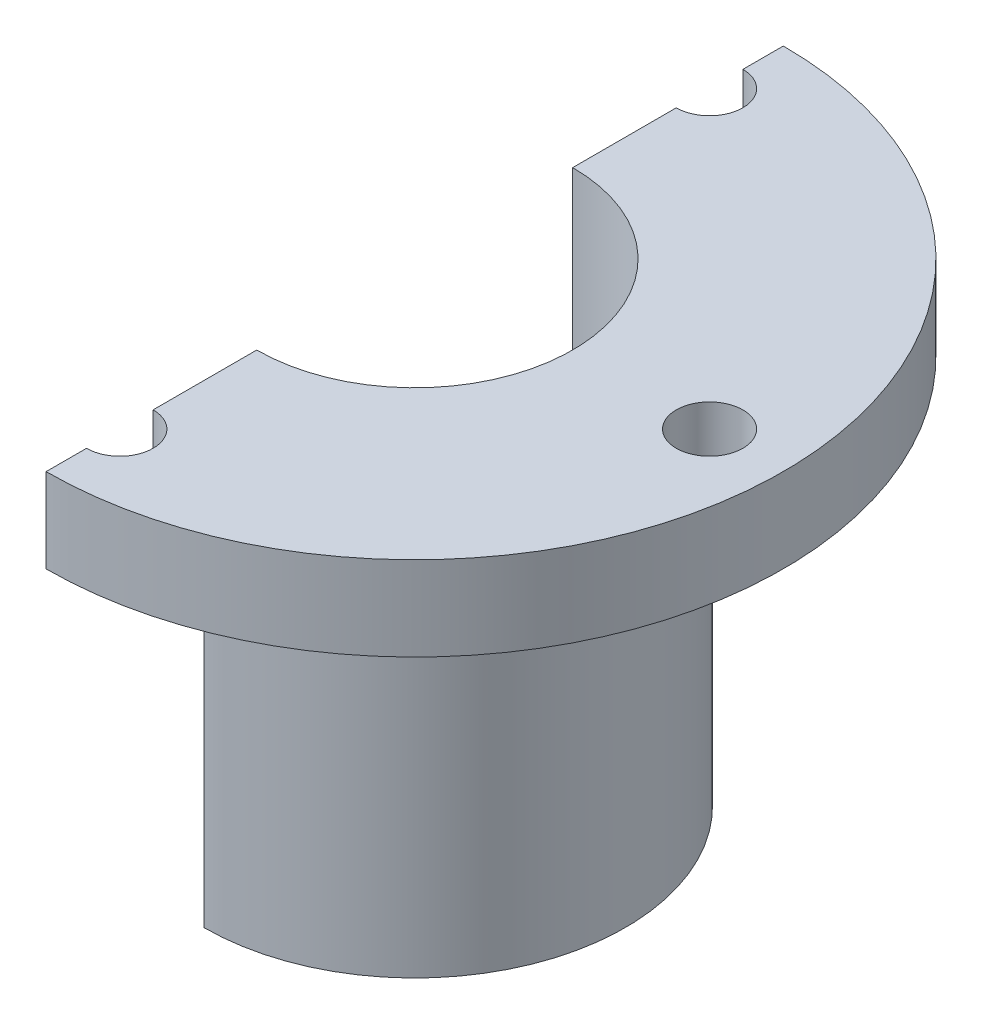
ISO-10303-21;
HEADER;
FILE_DESCRIPTION(('STEP AP214'),'2;1');
FILE_NAME('part.step','',(''),(''),'','','');
FILE_SCHEMA(('AUTOMOTIVE_DESIGN { 1 0 10303 214 1 1 1 1 }'));
ENDSEC;
DATA;
#1=APPLICATION_CONTEXT('core data for automotive mechanical design processes');
#2=APPLICATION_PROTOCOL_DEFINITION('international standard','automotive_design',2000,#1);
#3=PRODUCT_CONTEXT('',#1,'mechanical');
#4=PRODUCT('Part','Part','',(#3));
#5=PRODUCT_RELATED_PRODUCT_CATEGORY('part','',(#4));
#6=PRODUCT_DEFINITION_FORMATION('','',#4);
#7=PRODUCT_DEFINITION_CONTEXT('part definition',#1,'design');
#8=PRODUCT_DEFINITION('design','',#6,#7);
#9=PRODUCT_DEFINITION_SHAPE('','',#8);
#10=(LENGTH_UNIT() NAMED_UNIT(*) SI_UNIT(.MILLI.,.METRE.));
#11=(NAMED_UNIT(*) PLANE_ANGLE_UNIT() SI_UNIT($,.RADIAN.));
#12=(NAMED_UNIT(*) SI_UNIT($,.STERADIAN.) SOLID_ANGLE_UNIT());
#13=UNCERTAINTY_MEASURE_WITH_UNIT(LENGTH_MEASURE(1.E-05),#10,'distance_accuracy_value','');
#14=(GEOMETRIC_REPRESENTATION_CONTEXT(3) GLOBAL_UNCERTAINTY_ASSIGNED_CONTEXT((#13)) GLOBAL_UNIT_ASSIGNED_CONTEXT((#10,
#11,#12)) REPRESENTATION_CONTEXT('',''));
#15=CARTESIAN_POINT('',(0.,0.,0.));
#16=DIRECTION('',(0.,0.,1.));
#17=DIRECTION('',(1.,0.,0.));
#18=AXIS2_PLACEMENT_3D('',#15,#16,#17);
#19=CARTESIAN_POINT('',(0.,0.,15.0000000000001));
#20=DIRECTION('',(1.,0.,0.));
#21=DIRECTION('',(0.,0.,-1.));
#22=AXIS2_PLACEMENT_3D('',#19,#20,#21);
#23=PLANE('',#22);
#24=DIRECTION('',(0.,0.,-1.));
#25=VECTOR('',#24,1.);
#26=CARTESIAN_POINT('',(0.,17.,20.));
#27=LINE('',#26,#25);
#28=CARTESIAN_POINT('',(0.,17.,24.8377223398316));
#29=VERTEX_POINT('',#28);
#30=CARTESIAN_POINT('',(0.,17.,20.));
#31=VERTEX_POINT('',#30);
#32=EDGE_CURVE('E163',#29,#31,#27,.T.);
#33=ORIENTED_EDGE('',*,*,#32,.F.);
#34=DIRECTION('',(0.,1.,0.));
#35=VECTOR('',#34,1.);
#36=CARTESIAN_POINT('',(0.,-20.,24.8377223398316));
#37=LINE('',#36,#35);
#38=CARTESIAN_POINT('',(0.,25.,24.8377223398316));
#39=VERTEX_POINT('',#38);
#40=EDGE_CURVE('E11',#29,#39,#37,.T.);
#41=ORIENTED_EDGE('',*,*,#40,.T.);
#42=DIRECTION('',(0.,0.,1.));
#43=VECTOR('',#42,1.);
#44=CARTESIAN_POINT('',(0.,25.,35.));
#45=LINE('',#44,#43);
#46=CARTESIAN_POINT('',(0.,25.,15.0000000000001));
#47=VERTEX_POINT('',#46);
#48=EDGE_CURVE('E148',#47,#39,#45,.T.);
#49=ORIENTED_EDGE('',*,*,#48,.F.);
#50=DIRECTION('',(0.,1.,0.));
#51=VECTOR('',#50,1.);
#52=CARTESIAN_POINT('',(0.,25.,15.0000000000001));
#53=LINE('',#52,#51);
#54=CARTESIAN_POINT('',(0.,6.,15.0000000000001));
#55=VERTEX_POINT('',#54);
#56=EDGE_CURVE('E157',#55,#47,#53,.T.);
#57=ORIENTED_EDGE('',*,*,#56,.F.);
#58=DIRECTION('',(0.,0.,1.));
#59=VECTOR('',#58,1.);
#60=CARTESIAN_POINT('',(0.,6.,7.));
#61=LINE('',#60,#59);
#62=CARTESIAN_POINT('',(0.,6.,7.));
#63=VERTEX_POINT('',#62);
#64=EDGE_CURVE('E159',#63,#55,#61,.T.);
#65=ORIENTED_EDGE('',*,*,#64,.F.);
#66=DIRECTION('',(0.,1.,0.));
#67=VECTOR('',#66,1.);
#68=CARTESIAN_POINT('',(0.,0.,7.));
#69=LINE('',#68,#67);
#70=CARTESIAN_POINT('',(0.,0.,7.));
#71=VERTEX_POINT('',#70);
#72=EDGE_CURVE('E263',#71,#63,#69,.T.);
#73=ORIENTED_EDGE('',*,*,#72,.F.);
#74=DIRECTION('',(0.,0.,-1.));
#75=VECTOR('',#74,1.);
#76=CARTESIAN_POINT('',(0.,0.,7.));
#77=LINE('',#76,#75);
#78=CARTESIAN_POINT('',(0.,0.,17.5));
#79=VERTEX_POINT('',#78);
#80=EDGE_CURVE('E256',#79,#71,#77,.T.);
#81=ORIENTED_EDGE('',*,*,#80,.F.);
#82=DIRECTION('',(0.,1.,0.));
#83=VECTOR('',#82,1.);
#84=CARTESIAN_POINT('',(0.,0.,17.5));
#85=LINE('',#84,#83);
#86=CARTESIAN_POINT('',(0.,-20.,17.5));
#87=VERTEX_POINT('',#86);
#88=EDGE_CURVE('E171',#87,#79,#85,.T.);
#89=ORIENTED_EDGE('',*,*,#88,.F.);
#90=DIRECTION('',(0.,0.,-1.));
#91=VECTOR('',#90,1.);
#92=CARTESIAN_POINT('',(0.,-20.,17.5));
#93=LINE('',#92,#91);
#94=CARTESIAN_POINT('',(0.,-20.,20.));
#95=VERTEX_POINT('',#94);
#96=EDGE_CURVE('E169',#95,#87,#93,.T.);
#97=ORIENTED_EDGE('',*,*,#96,.F.);
#98=DIRECTION('',(0.,-1.,0.));
#99=VECTOR('',#98,1.);
#100=CARTESIAN_POINT('',(0.,-20.,20.));
#101=LINE('',#100,#99);
#102=EDGE_CURVE('E167',#31,#95,#101,.T.);
#103=ORIENTED_EDGE('',*,*,#102,.F.);
#104=EDGE_LOOP('',(#33,#41,#49,#57,#65,#73,#81,#89,#97,#103));
#105=FACE_BOUND('',#104,.T.);
#106=ADVANCED_FACE('F34',(#105),#23,.F.);
#107=CARTESIAN_POINT('',(-1.04744500833282E-13,0.,-15.0000000000001));
#108=DIRECTION('',(-1.,0.,0.));
#109=DIRECTION('',(0.,0.,1.));
#110=AXIS2_PLACEMENT_3D('',#107,#108,#109);
#111=PLANE('',#110);
#112=DIRECTION('',(0.,1.,0.));
#113=VECTOR('',#112,1.);
#114=CARTESIAN_POINT('',(-1.73440988554754E-13,-20.,-24.8377223398316));
#115=LINE('',#114,#113);
#116=CARTESIAN_POINT('',(-1.73440988554754E-13,17.,-24.8377223398316));
#117=VERTEX_POINT('',#116);
#118=CARTESIAN_POINT('',(-1.73440988554754E-13,25.,-24.8377223398316));
#119=VERTEX_POINT('',#118);
#120=EDGE_CURVE('E141',#117,#119,#115,.T.);
#121=ORIENTED_EDGE('',*,*,#120,.F.);
#122=DIRECTION('',(0.,0.,1.));
#123=VECTOR('',#122,1.);
#124=CARTESIAN_POINT('',(-1.39659334444375E-13,17.,-20.));
#125=LINE('',#124,#123);
#126=CARTESIAN_POINT('',(-1.39659334444375E-13,17.,-20.));
#127=VERTEX_POINT('',#126);
#128=EDGE_CURVE('E193',#117,#127,#125,.T.);
#129=ORIENTED_EDGE('',*,*,#128,.T.);
#130=DIRECTION('',(0.,-1.,0.));
#131=VECTOR('',#130,1.);
#132=CARTESIAN_POINT('',(-1.39659334444375E-13,-20.,-20.));
#133=LINE('',#132,#131);
#134=CARTESIAN_POINT('',(-1.39659334444375E-13,-20.,-20.));
#135=VERTEX_POINT('',#134);
#136=EDGE_CURVE('E200',#127,#135,#133,.T.);
#137=ORIENTED_EDGE('',*,*,#136,.T.);
#138=DIRECTION('',(0.,0.,1.));
#139=VECTOR('',#138,1.);
#140=CARTESIAN_POINT('',(-1.22201917638828E-13,-20.,-17.5));
#141=LINE('',#140,#139);
#142=CARTESIAN_POINT('',(-1.22201917638828E-13,-20.,-17.5));
#143=VERTEX_POINT('',#142);
#144=EDGE_CURVE('E205',#135,#143,#141,.T.);
#145=ORIENTED_EDGE('',*,*,#144,.T.);
#146=DIRECTION('',(0.,1.,0.));
#147=VECTOR('',#146,1.);
#148=CARTESIAN_POINT('',(-1.22201917638828E-13,0.,-17.5));
#149=LINE('',#148,#147);
#150=CARTESIAN_POINT('',(-1.22201917638828E-13,0.,-17.5));
#151=VERTEX_POINT('',#150);
#152=EDGE_CURVE('E203',#143,#151,#149,.T.);
#153=ORIENTED_EDGE('',*,*,#152,.T.);
#154=DIRECTION('',(0.,0.,1.));
#155=VECTOR('',#154,1.);
#156=CARTESIAN_POINT('',(0.,0.,-7.));
#157=LINE('',#156,#155);
#158=CARTESIAN_POINT('',(0.,0.,-7.));
#159=VERTEX_POINT('',#158);
#160=EDGE_CURVE('E176',#151,#159,#157,.T.);
#161=ORIENTED_EDGE('',*,*,#160,.T.);
#162=DIRECTION('',(0.,1.,0.));
#163=VECTOR('',#162,1.);
#164=CARTESIAN_POINT('',(0.,0.,-7.));
#165=LINE('',#164,#163);
#166=CARTESIAN_POINT('',(0.,6.,-7.));
#167=VERTEX_POINT('',#166);
#168=EDGE_CURVE('E177',#159,#167,#165,.T.);
#169=ORIENTED_EDGE('',*,*,#168,.T.);
#170=DIRECTION('',(0.,0.,-1.));
#171=VECTOR('',#170,1.);
#172=CARTESIAN_POINT('',(0.,6.,-7.));
#173=LINE('',#172,#171);
#174=CARTESIAN_POINT('',(-1.04744500833282E-13,6.,-15.0000000000001));
#175=VERTEX_POINT('',#174);
#176=EDGE_CURVE('E185',#167,#175,#173,.T.);
#177=ORIENTED_EDGE('',*,*,#176,.T.);
#178=DIRECTION('',(0.,1.,0.));
#179=VECTOR('',#178,1.);
#180=CARTESIAN_POINT('',(-1.04744500833282E-13,25.,-15.0000000000001));
#181=LINE('',#180,#179);
#182=CARTESIAN_POINT('',(-1.04744500833282E-13,25.,-15.0000000000001));
#183=VERTEX_POINT('',#182);
#184=EDGE_CURVE('E184',#175,#183,#181,.T.);
#185=ORIENTED_EDGE('',*,*,#184,.T.);
#186=DIRECTION('',(0.,0.,-1.));
#187=VECTOR('',#186,1.);
#188=CARTESIAN_POINT('',(-2.44403835277657E-13,25.,-35.));
#189=LINE('',#188,#187);
#190=EDGE_CURVE('E188',#183,#119,#189,.T.);
#191=ORIENTED_EDGE('',*,*,#190,.T.);
#192=EDGE_LOOP('',(#121,#129,#137,#145,#153,#161,#169,#177,#185,#191));
#193=FACE_BOUND('',#192,.T.);
#194=ADVANCED_FACE('F238',(#193),#111,.T.);
#195=CARTESIAN_POINT('',(0.,0.,-7.));
#196=DIRECTION('',(0.,1.,0.));
#197=DIRECTION('',(0.,0.,1.));
#198=AXIS2_PLACEMENT_3D('',#195,#196,#197);
#199=PLANE('',#198);
#200=CARTESIAN_POINT('',(0.,0.,0.));
#201=DIRECTION('',(0.,-1.,0.));
#202=DIRECTION('',(0.,0.,-1.));
#203=AXIS2_PLACEMENT_3D('',#200,#201,#202);
#204=CIRCLE('',#203,7.);
#205=EDGE_CURVE('E230',#159,#71,#204,.T.);
#206=ORIENTED_EDGE('',*,*,#205,.F.);
#207=ORIENTED_EDGE('',*,*,#160,.F.);
#208=CARTESIAN_POINT('',(0.,0.,0.));
#209=DIRECTION('',(0.,-1.,0.));
#210=DIRECTION('',(0.,0.,-1.));
#211=AXIS2_PLACEMENT_3D('',#208,#209,#210);
#212=CIRCLE('',#211,17.5);
#213=EDGE_CURVE('E210',#151,#79,#212,.T.);
#214=ORIENTED_EDGE('',*,*,#213,.T.);
#215=ORIENTED_EDGE('',*,*,#80,.T.);
#216=EDGE_LOOP('',(#206,#207,#214,#215));
#217=FACE_BOUND('',#216,.T.);
#218=ADVANCED_FACE('F275',(#217),#199,.F.);
#219=CARTESIAN_POINT('',(0.,0.,0.));
#220=DIRECTION('',(0.,-1.,0.));
#221=DIRECTION('',(0.,0.,-1.));
#222=AXIS2_PLACEMENT_3D('',#219,#220,#221);
#223=CYLINDRICAL_SURFACE('',#222,7.);
#224=CARTESIAN_POINT('',(0.,6.,0.));
#225=DIRECTION('',(0.,-1.,0.));
#226=DIRECTION('',(0.,0.,-1.));
#227=AXIS2_PLACEMENT_3D('',#224,#225,#226);
#228=CIRCLE('',#227,7.);
#229=EDGE_CURVE('E224',#167,#63,#228,.T.);
#230=ORIENTED_EDGE('',*,*,#229,.F.);
#231=ORIENTED_EDGE('',*,*,#168,.F.);
#232=ORIENTED_EDGE('',*,*,#205,.T.);
#233=ORIENTED_EDGE('',*,*,#72,.T.);
#234=EDGE_LOOP('',(#230,#231,#232,#233));
#235=FACE_BOUND('',#234,.T.);
#236=ADVANCED_FACE('F40',(#235),#223,.F.);
#237=CARTESIAN_POINT('',(0.,6.,-7.));
#238=DIRECTION('',(0.,-1.,0.));
#239=DIRECTION('',(0.,0.,-1.));
#240=AXIS2_PLACEMENT_3D('',#237,#238,#239);
#241=PLANE('',#240);
#242=CARTESIAN_POINT('',(0.,6.,0.));
#243=DIRECTION('',(0.,-1.,0.));
#244=DIRECTION('',(0.,0.,-1.));
#245=AXIS2_PLACEMENT_3D('',#242,#243,#244);
#246=CIRCLE('',#245,15.0000000000001);
#247=EDGE_CURVE('E223',#175,#55,#246,.T.);
#248=ORIENTED_EDGE('',*,*,#247,.F.);
#249=ORIENTED_EDGE('',*,*,#176,.F.);
#250=ORIENTED_EDGE('',*,*,#229,.T.);
#251=ORIENTED_EDGE('',*,*,#64,.T.);
#252=EDGE_LOOP('',(#248,#249,#250,#251));
#253=FACE_BOUND('',#252,.T.);
#254=ADVANCED_FACE('F264',(#253),#241,.F.);
#255=CARTESIAN_POINT('',(0.,0.,0.));
#256=DIRECTION('',(0.,-1.,0.));
#257=DIRECTION('',(0.,0.,-1.));
#258=AXIS2_PLACEMENT_3D('',#255,#256,#257);
#259=CYLINDRICAL_SURFACE('',#258,15.0000000000001);
#260=CARTESIAN_POINT('',(0.,25.,0.));
#261=DIRECTION('',(0.,-1.,0.));
#262=DIRECTION('',(0.,0.,-1.));
#263=AXIS2_PLACEMENT_3D('',#260,#261,#262);
#264=CIRCLE('',#263,15.0000000000001);
#265=EDGE_CURVE('E221',#183,#47,#264,.T.);
#266=ORIENTED_EDGE('',*,*,#265,.F.);
#267=ORIENTED_EDGE('',*,*,#184,.F.);
#268=ORIENTED_EDGE('',*,*,#247,.T.);
#269=ORIENTED_EDGE('',*,*,#56,.T.);
#270=EDGE_LOOP('',(#266,#267,#268,#269));
#271=FACE_BOUND('',#270,.T.);
#272=ADVANCED_FACE('F245',(#271),#259,.F.);
#273=CARTESIAN_POINT('',(-2.44403835277657E-13,25.,-35.));
#274=DIRECTION('',(0.,-1.,0.));
#275=DIRECTION('',(0.,0.,-1.));
#276=AXIS2_PLACEMENT_3D('',#273,#274,#275);
#277=PLANE('',#276);
#278=CARTESIAN_POINT('',(28.,25.,1.90849226708103E-13));
#279=DIRECTION('',(0.,1.,0.));
#280=DIRECTION('',(0.,0.,1.));
#281=AXIS2_PLACEMENT_3D('',#278,#279,#280);
#282=CIRCLE('',#281,3.16227766016838);
#283=CARTESIAN_POINT('',(28.,25.,3.16227766016857));
#284=VERTEX_POINT('',#283);
#285=EDGE_CURVE('E366',#284,#284,#282,.T.);
#286=ORIENTED_EDGE('',*,*,#285,.F.);
#287=EDGE_LOOP('',(#286));
#288=FACE_BOUND('',#287,.T.);
#289=ORIENTED_EDGE('',*,*,#48,.T.);
#290=CARTESIAN_POINT('',(-2.71830924516499E-13,25.,28.));
#291=DIRECTION('',(0.,1.,0.));
#292=DIRECTION('',(0.,0.,1.));
#293=AXIS2_PLACEMENT_3D('',#290,#291,#292);
#294=CIRCLE('',#293,3.16227766016838);
#295=CARTESIAN_POINT('',(0.,25.,31.1622776601684));
#296=VERTEX_POINT('',#295);
#297=EDGE_CURVE('E136',#296,#39,#294,.T.);
#298=ORIENTED_EDGE('',*,*,#297,.F.);
#299=CARTESIAN_POINT('',(0.,25.,35.));
#300=VERTEX_POINT('',#299);
#301=EDGE_CURVE('E150',#296,#300,#45,.T.);
#302=ORIENTED_EDGE('',*,*,#301,.T.);
#303=CARTESIAN_POINT('',(0.,25.,0.));
#304=DIRECTION('',(0.,-1.,0.));
#305=DIRECTION('',(0.,0.,-1.));
#306=AXIS2_PLACEMENT_3D('',#303,#304,#305);
#307=CIRCLE('',#306,35.);
#308=CARTESIAN_POINT('',(-2.44403835277657E-13,25.,-35.));
#309=VERTEX_POINT('',#308);
#310=EDGE_CURVE('E219',#309,#300,#307,.T.);
#311=ORIENTED_EDGE('',*,*,#310,.F.);
#312=CARTESIAN_POINT('',(-2.17605147889497E-13,25.,-31.1622776601684));
#313=VERTEX_POINT('',#312);
#314=EDGE_CURVE('E187',#313,#309,#189,.T.);
#315=ORIENTED_EDGE('',*,*,#314,.F.);
#316=CARTESIAN_POINT('',(1.19215211927752E-13,25.,-28.));
#317=DIRECTION('',(0.,1.,0.));
#318=DIRECTION('',(0.,0.,1.));
#319=AXIS2_PLACEMENT_3D('',#316,#317,#318);
#320=CIRCLE('',#319,3.16227766016838);
#321=EDGE_CURVE('E56',#119,#313,#320,.T.);
#322=ORIENTED_EDGE('',*,*,#321,.F.);
#323=ORIENTED_EDGE('',*,*,#190,.F.);
#324=ORIENTED_EDGE('',*,*,#265,.T.);
#325=EDGE_LOOP('',(#289,#298,#302,#311,#315,#322,#323,#324));
#326=FACE_BOUND('',#325,.T.);
#327=ADVANCED_FACE('F144',(#288,#326),#277,.F.);
#328=CARTESIAN_POINT('',(0.,0.,0.));
#329=DIRECTION('',(0.,-1.,0.));
#330=DIRECTION('',(0.,0.,-1.));
#331=AXIS2_PLACEMENT_3D('',#328,#329,#330);
#332=CYLINDRICAL_SURFACE('',#331,35.);
#333=CARTESIAN_POINT('',(0.,17.,0.));
#334=DIRECTION('',(0.,-1.,0.));
#335=DIRECTION('',(0.,0.,-1.));
#336=AXIS2_PLACEMENT_3D('',#333,#334,#335);
#337=CIRCLE('',#336,35.);
#338=CARTESIAN_POINT('',(-2.44403835277657E-13,17.,-35.));
#339=VERTEX_POINT('',#338);
#340=CARTESIAN_POINT('',(0.,17.,35.));
#341=VERTEX_POINT('',#340);
#342=EDGE_CURVE('E220',#339,#341,#337,.T.);
#343=ORIENTED_EDGE('',*,*,#342,.F.);
#344=DIRECTION('',(0.,-1.,0.));
#345=VECTOR('',#344,1.);
#346=CARTESIAN_POINT('',(-2.44403835277657E-13,17.,-35.));
#347=LINE('',#346,#345);
#348=EDGE_CURVE('E195',#309,#339,#347,.T.);
#349=ORIENTED_EDGE('',*,*,#348,.F.);
#350=ORIENTED_EDGE('',*,*,#310,.T.);
#351=DIRECTION('',(0.,-1.,0.));
#352=VECTOR('',#351,1.);
#353=CARTESIAN_POINT('',(0.,17.,35.));
#354=LINE('',#353,#352);
#355=EDGE_CURVE('E151',#300,#341,#354,.T.);
#356=ORIENTED_EDGE('',*,*,#355,.T.);
#357=EDGE_LOOP('',(#343,#349,#350,#356));
#358=FACE_BOUND('',#357,.T.);
#359=ADVANCED_FACE('F287',(#358),#332,.T.);
#360=CARTESIAN_POINT('',(-1.39659334444375E-13,17.,-20.));
#361=DIRECTION('',(0.,1.,0.));
#362=DIRECTION('',(0.,0.,1.));
#363=AXIS2_PLACEMENT_3D('',#360,#361,#362);
#364=PLANE('',#363);
#365=CARTESIAN_POINT('',(28.,17.,1.90849226708103E-13));
#366=DIRECTION('',(0.,1.,0.));
#367=DIRECTION('',(0.,0.,1.));
#368=AXIS2_PLACEMENT_3D('',#365,#366,#367);
#369=CIRCLE('',#368,3.16227766016838);
#370=CARTESIAN_POINT('',(28.,17.,3.16227766016857));
#371=VERTEX_POINT('',#370);
#372=EDGE_CURVE('E39',#371,#371,#369,.T.);
#373=ORIENTED_EDGE('',*,*,#372,.T.);
#374=EDGE_LOOP('',(#373));
#375=FACE_BOUND('',#374,.T.);
#376=CARTESIAN_POINT('',(0.,17.,31.1622776601684));
#377=VERTEX_POINT('',#376);
#378=EDGE_CURVE('E162',#341,#377,#27,.T.);
#379=ORIENTED_EDGE('',*,*,#378,.T.);
#380=CARTESIAN_POINT('',(-2.71830924516499E-13,17.,28.));
#381=DIRECTION('',(0.,1.,0.));
#382=DIRECTION('',(0.,0.,1.));
#383=AXIS2_PLACEMENT_3D('',#380,#381,#382);
#384=CIRCLE('',#383,3.16227766016838);
#385=EDGE_CURVE('E51',#377,#29,#384,.T.);
#386=ORIENTED_EDGE('',*,*,#385,.T.);
#387=ORIENTED_EDGE('',*,*,#32,.T.);
#388=CARTESIAN_POINT('',(0.,17.,0.));
#389=DIRECTION('',(0.,-1.,0.));
#390=DIRECTION('',(0.,0.,-1.));
#391=AXIS2_PLACEMENT_3D('',#388,#389,#390);
#392=CIRCLE('',#391,20.);
#393=EDGE_CURVE('E215',#127,#31,#392,.T.);
#394=ORIENTED_EDGE('',*,*,#393,.F.);
#395=ORIENTED_EDGE('',*,*,#128,.F.);
#396=CARTESIAN_POINT('',(1.19215211927752E-13,17.,-28.));
#397=DIRECTION('',(0.,1.,0.));
#398=DIRECTION('',(0.,0.,1.));
#399=AXIS2_PLACEMENT_3D('',#396,#397,#398);
#400=CIRCLE('',#399,3.16227766016838);
#401=CARTESIAN_POINT('',(-2.17605147889497E-13,17.,-31.1622776601684));
#402=VERTEX_POINT('',#401);
#403=EDGE_CURVE('E233',#117,#402,#400,.T.);
#404=ORIENTED_EDGE('',*,*,#403,.T.);
#405=EDGE_CURVE('E198',#339,#402,#125,.T.);
#406=ORIENTED_EDGE('',*,*,#405,.F.);
#407=ORIENTED_EDGE('',*,*,#342,.T.);
#408=EDGE_LOOP('',(#379,#386,#387,#394,#395,#404,#406,#407));
#409=FACE_BOUND('',#408,.T.);
#410=ADVANCED_FACE('F251',(#375,#409),#364,.F.);
#411=CARTESIAN_POINT('',(0.,0.,0.));
#412=DIRECTION('',(0.,-1.,0.));
#413=DIRECTION('',(0.,0.,-1.));
#414=AXIS2_PLACEMENT_3D('',#411,#412,#413);
#415=CYLINDRICAL_SURFACE('',#414,20.);
#416=CARTESIAN_POINT('',(0.,-20.,0.));
#417=DIRECTION('',(0.,-1.,0.));
#418=DIRECTION('',(0.,0.,-1.));
#419=AXIS2_PLACEMENT_3D('',#416,#417,#418);
#420=CIRCLE('',#419,20.);
#421=EDGE_CURVE('E212',#135,#95,#420,.T.);
#422=ORIENTED_EDGE('',*,*,#421,.F.);
#423=ORIENTED_EDGE('',*,*,#136,.F.);
#424=ORIENTED_EDGE('',*,*,#393,.T.);
#425=ORIENTED_EDGE('',*,*,#102,.T.);
#426=EDGE_LOOP('',(#422,#423,#424,#425));
#427=FACE_BOUND('',#426,.T.);
#428=ADVANCED_FACE('F285',(#427),#415,.T.);
#429=CARTESIAN_POINT('',(-1.22201917638828E-13,-20.,-17.5));
#430=DIRECTION('',(0.,1.,0.));
#431=DIRECTION('',(0.,0.,1.));
#432=AXIS2_PLACEMENT_3D('',#429,#430,#431);
#433=PLANE('',#432);
#434=CARTESIAN_POINT('',(0.,-20.,0.));
#435=DIRECTION('',(0.,-1.,0.));
#436=DIRECTION('',(0.,0.,-1.));
#437=AXIS2_PLACEMENT_3D('',#434,#435,#436);
#438=CIRCLE('',#437,17.5);
#439=EDGE_CURVE('E207',#143,#87,#438,.T.);
#440=ORIENTED_EDGE('',*,*,#439,.F.);
#441=ORIENTED_EDGE('',*,*,#144,.F.);
#442=ORIENTED_EDGE('',*,*,#421,.T.);
#443=ORIENTED_EDGE('',*,*,#96,.T.);
#444=EDGE_LOOP('',(#440,#441,#442,#443));
#445=FACE_BOUND('',#444,.T.);
#446=ADVANCED_FACE('F277',(#445),#433,.F.);
#447=CARTESIAN_POINT('',(0.,0.,0.));
#448=DIRECTION('',(0.,-1.,0.));
#449=DIRECTION('',(0.,0.,-1.));
#450=AXIS2_PLACEMENT_3D('',#447,#448,#449);
#451=CYLINDRICAL_SURFACE('',#450,17.5);
#452=ORIENTED_EDGE('',*,*,#152,.F.);
#453=ORIENTED_EDGE('',*,*,#439,.T.);
#454=ORIENTED_EDGE('',*,*,#88,.T.);
#455=ORIENTED_EDGE('',*,*,#213,.F.);
#456=EDGE_LOOP('',(#452,#453,#454,#455));
#457=FACE_BOUND('',#456,.T.);
#458=ADVANCED_FACE('F274',(#457),#451,.F.);
#459=DIRECTION('',(0.,1.,0.));
#460=VECTOR('',#459,1.);
#461=CARTESIAN_POINT('',(-2.17605147889497E-13,-20.,-31.1622776601684));
#462=LINE('',#461,#460);
#463=EDGE_CURVE('E227',#313,#402,#462,.F.);
#464=ORIENTED_EDGE('',*,*,#463,.F.);
#465=ORIENTED_EDGE('',*,*,#314,.T.);
#466=ORIENTED_EDGE('',*,*,#348,.T.);
#467=ORIENTED_EDGE('',*,*,#405,.T.);
#468=EDGE_LOOP('',(#464,#465,#466,#467));
#469=FACE_BOUND('',#468,.T.);
#470=ADVANCED_FACE('F283',(#469),#111,.T.);
#471=ORIENTED_EDGE('',*,*,#301,.F.);
#472=DIRECTION('',(0.,1.,0.));
#473=VECTOR('',#472,1.);
#474=CARTESIAN_POINT('',(0.,-20.,31.1622776601684));
#475=LINE('',#474,#473);
#476=EDGE_CURVE('E42',#296,#377,#475,.F.);
#477=ORIENTED_EDGE('',*,*,#476,.T.);
#478=ORIENTED_EDGE('',*,*,#378,.F.);
#479=ORIENTED_EDGE('',*,*,#355,.F.);
#480=EDGE_LOOP('',(#471,#477,#478,#479));
#481=FACE_BOUND('',#480,.T.);
#482=ADVANCED_FACE('F152',(#481),#23,.F.);
#483=CARTESIAN_POINT('',(1.19215211927752E-13,-20.,-28.));
#484=DIRECTION('',(0.,1.,0.));
#485=DIRECTION('',(0.,0.,1.));
#486=AXIS2_PLACEMENT_3D('',#483,#484,#485);
#487=CYLINDRICAL_SURFACE('',#486,3.16227766016838);
#488=ORIENTED_EDGE('',*,*,#120,.T.);
#489=ORIENTED_EDGE('',*,*,#321,.T.);
#490=ORIENTED_EDGE('',*,*,#463,.T.);
#491=ORIENTED_EDGE('',*,*,#403,.F.);
#492=EDGE_LOOP('',(#488,#489,#490,#491));
#493=FACE_BOUND('',#492,.T.);
#494=ADVANCED_FACE('F235',(#493),#487,.F.);
#495=CARTESIAN_POINT('',(-2.71830924516499E-13,-20.,28.));
#496=DIRECTION('',(0.,1.,0.));
#497=DIRECTION('',(0.,0.,1.));
#498=AXIS2_PLACEMENT_3D('',#495,#496,#497);
#499=CYLINDRICAL_SURFACE('',#498,3.16227766016838);
#500=ORIENTED_EDGE('',*,*,#385,.F.);
#501=ORIENTED_EDGE('',*,*,#476,.F.);
#502=ORIENTED_EDGE('',*,*,#297,.T.);
#503=ORIENTED_EDGE('',*,*,#40,.F.);
#504=EDGE_LOOP('',(#500,#501,#502,#503));
#505=FACE_BOUND('',#504,.T.);
#506=ADVANCED_FACE('F134',(#505),#499,.F.);
#507=CARTESIAN_POINT('',(28.,-20.,1.90849226708103E-13));
#508=DIRECTION('',(0.,1.,0.));
#509=DIRECTION('',(0.,0.,1.));
#510=AXIS2_PLACEMENT_3D('',#507,#508,#509);
#511=CYLINDRICAL_SURFACE('',#510,3.16227766016838);
#512=ORIENTED_EDGE('',*,*,#285,.T.);
#513=EDGE_LOOP('',(#512));
#514=FACE_BOUND('',#513,.T.);
#515=ORIENTED_EDGE('',*,*,#372,.F.);
#516=EDGE_LOOP('',(#515));
#517=FACE_BOUND('',#516,.T.);
#518=ADVANCED_FACE('F354',(#514,#517),#511,.F.);
#519=CLOSED_SHELL('',(#106,#194,#218,#236,#254,#272,#327,#359,#410,#428,#446,#458,#470,#482,
#494,#506,#518));
#520=MANIFOLD_SOLID_BREP('B2',#519);
#521=ADVANCED_BREP_SHAPE_REPRESENTATION('',(#18,#520),#14);
#522=SHAPE_DEFINITION_REPRESENTATION(#9,#521);
ENDSEC;
END-ISO-10303-21;
